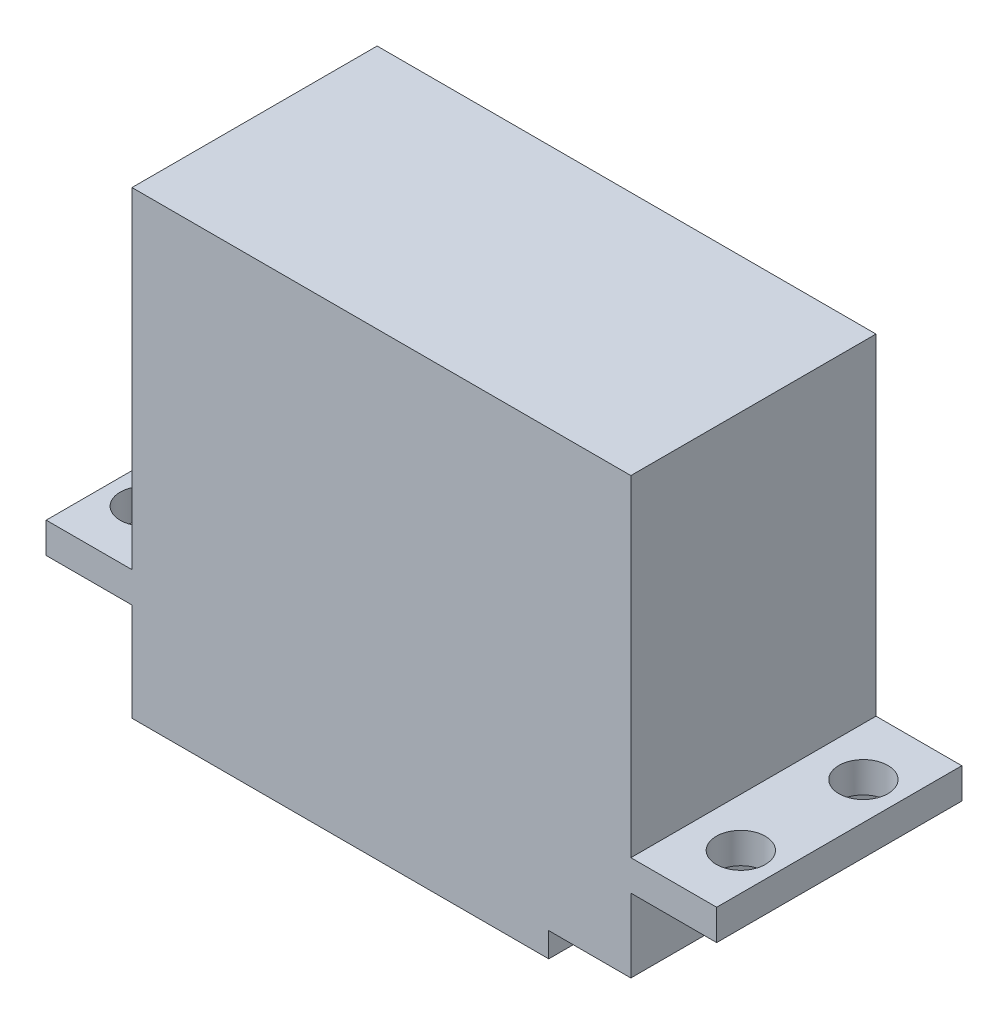
ISO-10303-21;
HEADER;
FILE_DESCRIPTION(('STEP AP214'),'2;1');
FILE_NAME('part.step','',(''),(''),'','','');
FILE_SCHEMA(('AUTOMOTIVE_DESIGN { 1 0 10303 214 1 1 1 1 }'));
ENDSEC;
DATA;
#1=APPLICATION_CONTEXT('core data for automotive mechanical design processes');
#2=APPLICATION_PROTOCOL_DEFINITION('international standard','automotive_design',2000,#1);
#3=PRODUCT_CONTEXT('',#1,'mechanical');
#4=PRODUCT('Part','Part','',(#3));
#5=PRODUCT_RELATED_PRODUCT_CATEGORY('part','',(#4));
#6=PRODUCT_DEFINITION_FORMATION('','',#4);
#7=PRODUCT_DEFINITION_CONTEXT('part definition',#1,'design');
#8=PRODUCT_DEFINITION('design','',#6,#7);
#9=PRODUCT_DEFINITION_SHAPE('','',#8);
#10=(LENGTH_UNIT() NAMED_UNIT(*) SI_UNIT(.MILLI.,.METRE.));
#11=(NAMED_UNIT(*) PLANE_ANGLE_UNIT() SI_UNIT($,.RADIAN.));
#12=(NAMED_UNIT(*) SI_UNIT($,.STERADIAN.) SOLID_ANGLE_UNIT());
#13=UNCERTAINTY_MEASURE_WITH_UNIT(LENGTH_MEASURE(1.E-05),#10,'distance_accuracy_value','');
#14=(GEOMETRIC_REPRESENTATION_CONTEXT(3) GLOBAL_UNCERTAINTY_ASSIGNED_CONTEXT((#13)) GLOBAL_UNIT_ASSIGNED_CONTEXT((#10,
#11,#12)) REPRESENTATION_CONTEXT('',''));
#15=CARTESIAN_POINT('',(0.,0.,0.));
#16=DIRECTION('',(0.,0.,1.));
#17=DIRECTION('',(1.,0.,0.));
#18=AXIS2_PLACEMENT_3D('',#15,#16,#17);
#19=CARTESIAN_POINT('',(20.35,-18.8445945945946,20.));
#20=DIRECTION('',(0.,1.,0.));
#21=DIRECTION('',(-1.,0.,0.));
#22=AXIS2_PLACEMENT_3D('',#19,#20,#21);
#23=PLANE('',#22);
#24=DIRECTION('',(0.,0.,1.));
#25=VECTOR('',#24,1.);
#26=CARTESIAN_POINT('',(13.65,-18.8445945945946,20.));
#27=LINE('',#26,#25);
#28=CARTESIAN_POINT('',(13.65,-18.8445945945946,0.));
#29=VERTEX_POINT('',#28);
#30=CARTESIAN_POINT('',(13.65,-18.8445945945946,20.));
#31=VERTEX_POINT('',#30);
#32=EDGE_CURVE('E52',#29,#31,#27,.T.);
#33=ORIENTED_EDGE('',*,*,#32,.F.);
#34=DIRECTION('',(1.,0.,0.));
#35=VECTOR('',#34,1.);
#36=CARTESIAN_POINT('',(20.35,-18.8445945945946,0.));
#37=LINE('',#36,#35);
#38=CARTESIAN_POINT('',(20.35,-18.8445945945946,0.));
#39=VERTEX_POINT('',#38);
#40=EDGE_CURVE('E180',#29,#39,#37,.T.);
#41=ORIENTED_EDGE('',*,*,#40,.T.);
#42=DIRECTION('',(0.,0.,-1.));
#43=VECTOR('',#42,1.);
#44=CARTESIAN_POINT('',(20.35,-18.8445945945946,20.));
#45=LINE('',#44,#43);
#46=CARTESIAN_POINT('',(20.35,-18.8445945945946,20.));
#47=VERTEX_POINT('',#46);
#48=EDGE_CURVE('E192',#47,#39,#45,.T.);
#49=ORIENTED_EDGE('',*,*,#48,.F.);
#50=DIRECTION('',(1.,0.,0.));
#51=VECTOR('',#50,1.);
#52=CARTESIAN_POINT('',(20.35,-18.8445945945946,20.));
#53=LINE('',#52,#51);
#54=EDGE_CURVE('E275',#31,#47,#53,.T.);
#55=ORIENTED_EDGE('',*,*,#54,.F.);
#56=EDGE_LOOP('',(#33,#41,#49,#55));
#57=FACE_BOUND('',#56,.T.);
#58=ADVANCED_FACE('F35',(#57),#23,.F.);
#59=CARTESIAN_POINT('',(20.35,16.6554054054054,20.));
#60=DIRECTION('',(-1.,0.,0.));
#61=DIRECTION('',(0.,-1.,0.));
#62=AXIS2_PLACEMENT_3D('',#59,#60,#61);
#63=PLANE('',#62);
#64=DIRECTION('',(0.,1.,0.));
#65=VECTOR('',#64,1.);
#66=CARTESIAN_POINT('',(20.35,16.6554054054054,0.));
#67=LINE('',#66,#65);
#68=CARTESIAN_POINT('',(20.35,-10.3445945945946,0.));
#69=VERTEX_POINT('',#68);
#70=CARTESIAN_POINT('',(20.35,16.6554054054054,0.));
#71=VERTEX_POINT('',#70);
#72=EDGE_CURVE('E163',#69,#71,#67,.T.);
#73=ORIENTED_EDGE('',*,*,#72,.T.);
#74=DIRECTION('',(0.,0.,-1.));
#75=VECTOR('',#74,1.);
#76=CARTESIAN_POINT('',(20.35,16.6554054054054,20.));
#77=LINE('',#76,#75);
#78=CARTESIAN_POINT('',(20.35,16.6554054054054,20.));
#79=VERTEX_POINT('',#78);
#80=EDGE_CURVE('E11',#79,#71,#77,.T.);
#81=ORIENTED_EDGE('',*,*,#80,.F.);
#82=DIRECTION('',(0.,1.,0.));
#83=VECTOR('',#82,1.);
#84=CARTESIAN_POINT('',(20.35,16.6554054054054,20.));
#85=LINE('',#84,#83);
#86=CARTESIAN_POINT('',(20.35,-10.3445945945946,20.));
#87=VERTEX_POINT('',#86);
#88=EDGE_CURVE('E188',#87,#79,#85,.T.);
#89=ORIENTED_EDGE('',*,*,#88,.F.);
#90=DIRECTION('',(0.,0.,-1.));
#91=VECTOR('',#90,1.);
#92=CARTESIAN_POINT('',(20.35,-10.3445945945946,20.));
#93=LINE('',#92,#91);
#94=EDGE_CURVE('E159',#87,#69,#93,.T.);
#95=ORIENTED_EDGE('',*,*,#94,.T.);
#96=EDGE_LOOP('',(#73,#81,#89,#95));
#97=FACE_BOUND('',#96,.T.);
#98=ADVANCED_FACE('F37',(#97),#63,.F.);
#99=CARTESIAN_POINT('',(-20.35,16.6554054054054,20.));
#100=DIRECTION('',(0.,-1.,0.));
#101=DIRECTION('',(1.,0.,0.));
#102=AXIS2_PLACEMENT_3D('',#99,#100,#101);
#103=PLANE('',#102);
#104=DIRECTION('',(-1.,0.,0.));
#105=VECTOR('',#104,1.);
#106=CARTESIAN_POINT('',(-20.35,16.6554054054054,0.));
#107=LINE('',#106,#105);
#108=CARTESIAN_POINT('',(-20.35,16.6554054054054,0.));
#109=VERTEX_POINT('',#108);
#110=EDGE_CURVE('E166',#71,#109,#107,.T.);
#111=ORIENTED_EDGE('',*,*,#110,.T.);
#112=DIRECTION('',(0.,0.,-1.));
#113=VECTOR('',#112,1.);
#114=CARTESIAN_POINT('',(-20.35,16.6554054054054,20.));
#115=LINE('',#114,#113);
#116=CARTESIAN_POINT('',(-20.35,16.6554054054054,20.));
#117=VERTEX_POINT('',#116);
#118=EDGE_CURVE('E44',#117,#109,#115,.T.);
#119=ORIENTED_EDGE('',*,*,#118,.F.);
#120=DIRECTION('',(-1.,0.,0.));
#121=VECTOR('',#120,1.);
#122=CARTESIAN_POINT('',(-20.35,16.6554054054054,20.));
#123=LINE('',#122,#121);
#124=EDGE_CURVE('E110',#79,#117,#123,.T.);
#125=ORIENTED_EDGE('',*,*,#124,.F.);
#126=ORIENTED_EDGE('',*,*,#80,.T.);
#127=EDGE_LOOP('',(#111,#119,#125,#126));
#128=FACE_BOUND('',#127,.T.);
#129=ADVANCED_FACE('F291',(#128),#103,.F.);
#130=CARTESIAN_POINT('',(-20.35,16.6554054054054,20.));
#131=DIRECTION('',(1.,0.,0.));
#132=DIRECTION('',(0.,1.,0.));
#133=AXIS2_PLACEMENT_3D('',#130,#131,#132);
#134=PLANE('',#133);
#135=DIRECTION('',(0.,-1.,0.));
#136=VECTOR('',#135,1.);
#137=CARTESIAN_POINT('',(-20.35,16.6554054054054,0.));
#138=LINE('',#137,#136);
#139=CARTESIAN_POINT('',(-20.35,-10.3445945945946,0.));
#140=VERTEX_POINT('',#139);
#141=EDGE_CURVE('E169',#109,#140,#138,.T.);
#142=ORIENTED_EDGE('',*,*,#141,.T.);
#143=DIRECTION('',(0.,0.,-1.));
#144=VECTOR('',#143,1.);
#145=CARTESIAN_POINT('',(-20.35,-10.3445945945946,20.));
#146=LINE('',#145,#144);
#147=CARTESIAN_POINT('',(-20.35,-10.3445945945946,20.));
#148=VERTEX_POINT('',#147);
#149=EDGE_CURVE('E204',#148,#140,#146,.T.);
#150=ORIENTED_EDGE('',*,*,#149,.F.);
#151=DIRECTION('',(0.,-1.,0.));
#152=VECTOR('',#151,1.);
#153=CARTESIAN_POINT('',(-20.35,16.6554054054054,20.));
#154=LINE('',#153,#152);
#155=EDGE_CURVE('E264',#117,#148,#154,.T.);
#156=ORIENTED_EDGE('',*,*,#155,.F.);
#157=ORIENTED_EDGE('',*,*,#118,.T.);
#158=EDGE_LOOP('',(#142,#150,#156,#157));
#159=FACE_BOUND('',#158,.T.);
#160=ADVANCED_FACE('F294',(#159),#134,.F.);
#161=CARTESIAN_POINT('',(-20.35,-10.3445945945946,20.));
#162=DIRECTION('',(0.,-1.,0.));
#163=DIRECTION('',(0.,0.,-1.));
#164=AXIS2_PLACEMENT_3D('',#161,#162,#163);
#165=PLANE('',#164);
#166=CARTESIAN_POINT('',(-24.315,-10.3445945945946,4.99354097072405));
#167=DIRECTION('',(0.,1.,0.));
#168=DIRECTION('',(0.,0.,1.));
#169=AXIS2_PLACEMENT_3D('',#166,#167,#168);
#170=CIRCLE('',#169,2.);
#171=CARTESIAN_POINT('',(-24.315,-10.3445945945946,6.99354097072405));
#172=VERTEX_POINT('',#171);
#173=EDGE_CURVE('E216',#172,#172,#170,.T.);
#174=ORIENTED_EDGE('',*,*,#173,.F.);
#175=EDGE_LOOP('',(#174));
#176=FACE_BOUND('',#175,.T.);
#177=CARTESIAN_POINT('',(-24.315,-10.3445945945946,14.993540970724));
#178=DIRECTION('',(0.,1.,0.));
#179=DIRECTION('',(0.,0.,-1.));
#180=AXIS2_PLACEMENT_3D('',#177,#178,#179);
#181=CIRCLE('',#180,2.);
#182=CARTESIAN_POINT('',(-24.315,-10.3445945945946,12.993540970724));
#183=VERTEX_POINT('',#182);
#184=EDGE_CURVE('E225',#183,#183,#181,.T.);
#185=ORIENTED_EDGE('',*,*,#184,.F.);
#186=EDGE_LOOP('',(#185));
#187=FACE_BOUND('',#186,.T.);
#188=DIRECTION('',(-1.,0.,0.));
#189=VECTOR('',#188,1.);
#190=CARTESIAN_POINT('',(-20.35,-10.3445945945946,0.));
#191=LINE('',#190,#189);
#192=CARTESIAN_POINT('',(-27.35,-10.3445945945946,0.));
#193=VERTEX_POINT('',#192);
#194=EDGE_CURVE('E171',#140,#193,#191,.T.);
#195=ORIENTED_EDGE('',*,*,#194,.T.);
#196=DIRECTION('',(0.,0.,-1.));
#197=VECTOR('',#196,1.);
#198=CARTESIAN_POINT('',(-27.35,-10.3445945945946,20.));
#199=LINE('',#198,#197);
#200=CARTESIAN_POINT('',(-27.35,-10.3445945945946,20.));
#201=VERTEX_POINT('',#200);
#202=EDGE_CURVE('E201',#201,#193,#199,.T.);
#203=ORIENTED_EDGE('',*,*,#202,.F.);
#204=DIRECTION('',(-1.,0.,0.));
#205=VECTOR('',#204,1.);
#206=CARTESIAN_POINT('',(-20.35,-10.3445945945946,20.));
#207=LINE('',#206,#205);
#208=EDGE_CURVE('E266',#148,#201,#207,.T.);
#209=ORIENTED_EDGE('',*,*,#208,.F.);
#210=ORIENTED_EDGE('',*,*,#149,.T.);
#211=EDGE_LOOP('',(#195,#203,#209,#210));
#212=FACE_BOUND('',#211,.T.);
#213=ADVANCED_FACE('F299',(#176,#187,#212),#165,.F.);
#214=CARTESIAN_POINT('',(-27.35,-10.3445945945946,20.));
#215=DIRECTION('',(1.,0.,0.));
#216=DIRECTION('',(0.,1.,0.));
#217=AXIS2_PLACEMENT_3D('',#214,#215,#216);
#218=PLANE('',#217);
#219=DIRECTION('',(0.,-1.,0.));
#220=VECTOR('',#219,1.);
#221=CARTESIAN_POINT('',(-27.35,-10.3445945945946,0.));
#222=LINE('',#221,#220);
#223=CARTESIAN_POINT('',(-27.35,-12.8445945945946,0.));
#224=VERTEX_POINT('',#223);
#225=EDGE_CURVE('E173',#193,#224,#222,.T.);
#226=ORIENTED_EDGE('',*,*,#225,.T.);
#227=DIRECTION('',(0.,0.,-1.));
#228=VECTOR('',#227,1.);
#229=CARTESIAN_POINT('',(-27.35,-12.8445945945946,20.));
#230=LINE('',#229,#228);
#231=CARTESIAN_POINT('',(-27.35,-12.8445945945946,20.));
#232=VERTEX_POINT('',#231);
#233=EDGE_CURVE('E198',#232,#224,#230,.T.);
#234=ORIENTED_EDGE('',*,*,#233,.F.);
#235=DIRECTION('',(0.,-1.,0.));
#236=VECTOR('',#235,1.);
#237=CARTESIAN_POINT('',(-27.35,-10.3445945945946,20.));
#238=LINE('',#237,#236);
#239=EDGE_CURVE('E268',#201,#232,#238,.T.);
#240=ORIENTED_EDGE('',*,*,#239,.F.);
#241=ORIENTED_EDGE('',*,*,#202,.T.);
#242=EDGE_LOOP('',(#226,#234,#240,#241));
#243=FACE_BOUND('',#242,.T.);
#244=ADVANCED_FACE('F305',(#243),#218,.F.);
#245=CARTESIAN_POINT('',(-27.35,-12.8445945945946,20.));
#246=DIRECTION('',(0.,1.,0.));
#247=DIRECTION('',(-1.,0.,0.));
#248=AXIS2_PLACEMENT_3D('',#245,#246,#247);
#249=PLANE('',#248);
#250=CARTESIAN_POINT('',(-24.315,-12.8445945945946,4.99354097072405));
#251=DIRECTION('',(0.,1.,0.));
#252=DIRECTION('',(-1.,0.,0.));
#253=AXIS2_PLACEMENT_3D('',#250,#251,#252);
#254=CIRCLE('',#253,2.);
#255=CARTESIAN_POINT('',(-26.315,-12.8445945945946,4.99354097072405));
#256=VERTEX_POINT('',#255);
#257=EDGE_CURVE('E39',#256,#256,#254,.T.);
#258=ORIENTED_EDGE('',*,*,#257,.T.);
#259=EDGE_LOOP('',(#258));
#260=FACE_BOUND('',#259,.T.);
#261=CARTESIAN_POINT('',(-24.315,-12.8445945945946,14.993540970724));
#262=DIRECTION('',(0.,1.,0.));
#263=DIRECTION('',(-1.,0.,0.));
#264=AXIS2_PLACEMENT_3D('',#261,#262,#263);
#265=CIRCLE('',#264,2.);
#266=CARTESIAN_POINT('',(-26.315,-12.8445945945946,14.993540970724));
#267=VERTEX_POINT('',#266);
#268=EDGE_CURVE('E208',#267,#267,#265,.T.);
#269=ORIENTED_EDGE('',*,*,#268,.T.);
#270=EDGE_LOOP('',(#269));
#271=FACE_BOUND('',#270,.T.);
#272=DIRECTION('',(1.,0.,0.));
#273=VECTOR('',#272,1.);
#274=CARTESIAN_POINT('',(-27.35,-12.8445945945946,0.));
#275=LINE('',#274,#273);
#276=CARTESIAN_POINT('',(-20.35,-12.8445945945946,0.));
#277=VERTEX_POINT('',#276);
#278=EDGE_CURVE('E175',#224,#277,#275,.T.);
#279=ORIENTED_EDGE('',*,*,#278,.T.);
#280=DIRECTION('',(0.,0.,-1.));
#281=VECTOR('',#280,1.);
#282=CARTESIAN_POINT('',(-20.35,-12.8445945945946,20.));
#283=LINE('',#282,#281);
#284=CARTESIAN_POINT('',(-20.35,-12.8445945945946,20.));
#285=VERTEX_POINT('',#284);
#286=EDGE_CURVE('E195',#285,#277,#283,.T.);
#287=ORIENTED_EDGE('',*,*,#286,.F.);
#288=DIRECTION('',(1.,0.,0.));
#289=VECTOR('',#288,1.);
#290=CARTESIAN_POINT('',(-27.35,-12.8445945945946,20.));
#291=LINE('',#290,#289);
#292=EDGE_CURVE('E270',#232,#285,#291,.T.);
#293=ORIENTED_EDGE('',*,*,#292,.F.);
#294=ORIENTED_EDGE('',*,*,#233,.T.);
#295=EDGE_LOOP('',(#279,#287,#293,#294));
#296=FACE_BOUND('',#295,.T.);
#297=ADVANCED_FACE('F309',(#260,#271,#296),#249,.F.);
#298=CARTESIAN_POINT('',(-20.35,-12.8445945945946,20.));
#299=DIRECTION('',(1.,0.,0.));
#300=DIRECTION('',(0.,0.,-1.));
#301=AXIS2_PLACEMENT_3D('',#298,#299,#300);
#302=PLANE('',#301);
#303=DIRECTION('',(0.,-1.,0.));
#304=VECTOR('',#303,1.);
#305=CARTESIAN_POINT('',(-20.35,-12.8445945945946,0.));
#306=LINE('',#305,#304);
#307=CARTESIAN_POINT('',(-20.35,-20.8445945945946,0.));
#308=VERTEX_POINT('',#307);
#309=EDGE_CURVE('E177',#277,#308,#306,.T.);
#310=ORIENTED_EDGE('',*,*,#309,.T.);
#311=DIRECTION('',(0.,0.,-1.));
#312=VECTOR('',#311,1.);
#313=CARTESIAN_POINT('',(-20.35,-20.8445945945946,20.));
#314=LINE('',#313,#312);
#315=CARTESIAN_POINT('',(-20.35,-20.8445945945946,20.));
#316=VERTEX_POINT('',#315);
#317=EDGE_CURVE('E244',#316,#308,#314,.T.);
#318=ORIENTED_EDGE('',*,*,#317,.F.);
#319=DIRECTION('',(0.,-1.,0.));
#320=VECTOR('',#319,1.);
#321=CARTESIAN_POINT('',(-20.35,-12.8445945945946,20.));
#322=LINE('',#321,#320);
#323=EDGE_CURVE('E272',#285,#316,#322,.T.);
#324=ORIENTED_EDGE('',*,*,#323,.F.);
#325=ORIENTED_EDGE('',*,*,#286,.T.);
#326=EDGE_LOOP('',(#310,#318,#324,#325));
#327=FACE_BOUND('',#326,.T.);
#328=ADVANCED_FACE('F314',(#327),#302,.F.);
#329=CARTESIAN_POINT('',(20.35,-12.8445945945946,20.));
#330=DIRECTION('',(-1.,0.,0.));
#331=DIRECTION('',(0.,0.,1.));
#332=AXIS2_PLACEMENT_3D('',#329,#330,#331);
#333=PLANE('',#332);
#334=DIRECTION('',(0.,1.,0.));
#335=VECTOR('',#334,1.);
#336=CARTESIAN_POINT('',(20.35,-12.8445945945946,0.));
#337=LINE('',#336,#335);
#338=CARTESIAN_POINT('',(20.35,-12.8445945945946,0.));
#339=VERTEX_POINT('',#338);
#340=EDGE_CURVE('E182',#39,#339,#337,.T.);
#341=ORIENTED_EDGE('',*,*,#340,.T.);
#342=DIRECTION('',(0.,0.,-1.));
#343=VECTOR('',#342,1.);
#344=CARTESIAN_POINT('',(20.35,-12.8445945945946,20.));
#345=LINE('',#344,#343);
#346=CARTESIAN_POINT('',(20.35,-12.8445945945946,20.));
#347=VERTEX_POINT('',#346);
#348=EDGE_CURVE('E154',#347,#339,#345,.T.);
#349=ORIENTED_EDGE('',*,*,#348,.F.);
#350=DIRECTION('',(0.,1.,0.));
#351=VECTOR('',#350,1.);
#352=CARTESIAN_POINT('',(20.35,-12.8445945945946,20.));
#353=LINE('',#352,#351);
#354=EDGE_CURVE('E142',#47,#347,#353,.T.);
#355=ORIENTED_EDGE('',*,*,#354,.F.);
#356=ORIENTED_EDGE('',*,*,#48,.T.);
#357=EDGE_LOOP('',(#341,#349,#355,#356));
#358=FACE_BOUND('',#357,.T.);
#359=ADVANCED_FACE('F281',(#358),#333,.F.);
#360=CARTESIAN_POINT('',(27.35,-12.8445945945946,20.));
#361=DIRECTION('',(0.,1.,0.));
#362=DIRECTION('',(0.,0.,1.));
#363=AXIS2_PLACEMENT_3D('',#360,#361,#362);
#364=PLANE('',#363);
#365=CARTESIAN_POINT('',(24.315,-12.8445945945946,14.993540970724));
#366=DIRECTION('',(0.,1.,0.));
#367=DIRECTION('',(0.,0.,1.));
#368=AXIS2_PLACEMENT_3D('',#365,#366,#367);
#369=CIRCLE('',#368,2.);
#370=CARTESIAN_POINT('',(24.315,-12.8445945945946,16.9935409707241));
#371=VERTEX_POINT('',#370);
#372=EDGE_CURVE('E210',#371,#371,#369,.T.);
#373=ORIENTED_EDGE('',*,*,#372,.T.);
#374=EDGE_LOOP('',(#373));
#375=FACE_BOUND('',#374,.T.);
#376=CARTESIAN_POINT('',(24.315,-12.8445945945946,4.99354097072405));
#377=DIRECTION('',(0.,1.,0.));
#378=DIRECTION('',(0.,0.,1.));
#379=AXIS2_PLACEMENT_3D('',#376,#377,#378);
#380=CIRCLE('',#379,2.);
#381=CARTESIAN_POINT('',(24.315,-12.8445945945946,6.99354097072405));
#382=VERTEX_POINT('',#381);
#383=EDGE_CURVE('E229',#382,#382,#380,.T.);
#384=ORIENTED_EDGE('',*,*,#383,.T.);
#385=EDGE_LOOP('',(#384));
#386=FACE_BOUND('',#385,.T.);
#387=DIRECTION('',(1.,0.,0.));
#388=VECTOR('',#387,1.);
#389=CARTESIAN_POINT('',(27.35,-12.8445945945946,0.));
#390=LINE('',#389,#388);
#391=CARTESIAN_POINT('',(27.35,-12.8445945945946,0.));
#392=VERTEX_POINT('',#391);
#393=EDGE_CURVE('E151',#339,#392,#390,.T.);
#394=ORIENTED_EDGE('',*,*,#393,.T.);
#395=DIRECTION('',(0.,0.,-1.));
#396=VECTOR('',#395,1.);
#397=CARTESIAN_POINT('',(27.35,-12.8445945945946,20.));
#398=LINE('',#397,#396);
#399=CARTESIAN_POINT('',(27.35,-12.8445945945946,20.));
#400=VERTEX_POINT('',#399);
#401=EDGE_CURVE('E148',#400,#392,#398,.T.);
#402=ORIENTED_EDGE('',*,*,#401,.F.);
#403=DIRECTION('',(1.,0.,0.));
#404=VECTOR('',#403,1.);
#405=CARTESIAN_POINT('',(27.35,-12.8445945945946,20.));
#406=LINE('',#405,#404);
#407=EDGE_CURVE('E135',#347,#400,#406,.T.);
#408=ORIENTED_EDGE('',*,*,#407,.F.);
#409=ORIENTED_EDGE('',*,*,#348,.T.);
#410=EDGE_LOOP('',(#394,#402,#408,#409));
#411=FACE_BOUND('',#410,.T.);
#412=ADVANCED_FACE('F149',(#375,#386,#411),#364,.F.);
#413=CARTESIAN_POINT('',(27.35,-10.3445945945946,20.));
#414=DIRECTION('',(-1.,0.,0.));
#415=DIRECTION('',(0.,-1.,0.));
#416=AXIS2_PLACEMENT_3D('',#413,#414,#415);
#417=PLANE('',#416);
#418=DIRECTION('',(0.,1.,0.));
#419=VECTOR('',#418,1.);
#420=CARTESIAN_POINT('',(27.35,-10.3445945945946,0.));
#421=LINE('',#420,#419);
#422=CARTESIAN_POINT('',(27.35,-10.3445945945946,0.));
#423=VERTEX_POINT('',#422);
#424=EDGE_CURVE('E185',#392,#423,#421,.T.);
#425=ORIENTED_EDGE('',*,*,#424,.T.);
#426=DIRECTION('',(0.,0.,-1.));
#427=VECTOR('',#426,1.);
#428=CARTESIAN_POINT('',(27.35,-10.3445945945946,20.));
#429=LINE('',#428,#427);
#430=CARTESIAN_POINT('',(27.35,-10.3445945945946,20.));
#431=VERTEX_POINT('',#430);
#432=EDGE_CURVE('E155',#431,#423,#429,.T.);
#433=ORIENTED_EDGE('',*,*,#432,.F.);
#434=DIRECTION('',(0.,1.,0.));
#435=VECTOR('',#434,1.);
#436=CARTESIAN_POINT('',(27.35,-10.3445945945946,20.));
#437=LINE('',#436,#435);
#438=EDGE_CURVE('E139',#400,#431,#437,.T.);
#439=ORIENTED_EDGE('',*,*,#438,.F.);
#440=ORIENTED_EDGE('',*,*,#401,.T.);
#441=EDGE_LOOP('',(#425,#433,#439,#440));
#442=FACE_BOUND('',#441,.T.);
#443=ADVANCED_FACE('F157',(#442),#417,.F.);
#444=CARTESIAN_POINT('',(20.35,-10.3445945945946,20.));
#445=DIRECTION('',(0.,-1.,0.));
#446=DIRECTION('',(1.,0.,0.));
#447=AXIS2_PLACEMENT_3D('',#444,#445,#446);
#448=PLANE('',#447);
#449=CARTESIAN_POINT('',(24.315,-10.3445945945946,14.993540970724));
#450=DIRECTION('',(0.,1.,0.));
#451=DIRECTION('',(0.,0.,1.));
#452=AXIS2_PLACEMENT_3D('',#449,#450,#451);
#453=CIRCLE('',#452,2.);
#454=CARTESIAN_POINT('',(24.315,-10.3445945945946,16.9935409707241));
#455=VERTEX_POINT('',#454);
#456=EDGE_CURVE('E221',#455,#455,#453,.T.);
#457=ORIENTED_EDGE('',*,*,#456,.F.);
#458=EDGE_LOOP('',(#457));
#459=FACE_BOUND('',#458,.T.);
#460=CARTESIAN_POINT('',(24.315,-10.3445945945946,4.99354097072405));
#461=DIRECTION('',(0.,1.,0.));
#462=DIRECTION('',(0.,0.,-1.));
#463=AXIS2_PLACEMENT_3D('',#460,#461,#462);
#464=CIRCLE('',#463,2.);
#465=CARTESIAN_POINT('',(24.315,-10.3445945945946,2.99354097072404));
#466=VERTEX_POINT('',#465);
#467=EDGE_CURVE('E214',#466,#466,#464,.T.);
#468=ORIENTED_EDGE('',*,*,#467,.F.);
#469=EDGE_LOOP('',(#468));
#470=FACE_BOUND('',#469,.T.);
#471=DIRECTION('',(-1.,0.,0.));
#472=VECTOR('',#471,1.);
#473=CARTESIAN_POINT('',(20.35,-10.3445945945946,0.));
#474=LINE('',#473,#472);
#475=EDGE_CURVE('E102',#423,#69,#474,.T.);
#476=ORIENTED_EDGE('',*,*,#475,.T.);
#477=ORIENTED_EDGE('',*,*,#94,.F.);
#478=DIRECTION('',(-1.,0.,0.));
#479=VECTOR('',#478,1.);
#480=CARTESIAN_POINT('',(20.35,-10.3445945945946,20.));
#481=LINE('',#480,#479);
#482=EDGE_CURVE('E61',#431,#87,#481,.T.);
#483=ORIENTED_EDGE('',*,*,#482,.F.);
#484=ORIENTED_EDGE('',*,*,#432,.T.);
#485=EDGE_LOOP('',(#476,#477,#483,#484));
#486=FACE_BOUND('',#485,.T.);
#487=ADVANCED_FACE('F285',(#459,#470,#486),#448,.F.);
#488=CARTESIAN_POINT('',(0.,0.,20.));
#489=DIRECTION('',(0.,0.,1.));
#490=DIRECTION('',(1.,0.,0.));
#491=AXIS2_PLACEMENT_3D('',#488,#489,#490);
#492=PLANE('',#491);
#493=ORIENTED_EDGE('',*,*,#88,.T.);
#494=ORIENTED_EDGE('',*,*,#124,.T.);
#495=ORIENTED_EDGE('',*,*,#155,.T.);
#496=ORIENTED_EDGE('',*,*,#208,.T.);
#497=ORIENTED_EDGE('',*,*,#239,.T.);
#498=ORIENTED_EDGE('',*,*,#292,.T.);
#499=ORIENTED_EDGE('',*,*,#323,.T.);
#500=DIRECTION('',(-1.,0.,0.));
#501=VECTOR('',#500,1.);
#502=CARTESIAN_POINT('',(-20.35,-20.8445945945946,20.));
#503=LINE('',#502,#501);
#504=CARTESIAN_POINT('',(13.65,-20.8445945945946,20.));
#505=VERTEX_POINT('',#504);
#506=EDGE_CURVE('E253',#505,#316,#503,.T.);
#507=ORIENTED_EDGE('',*,*,#506,.F.);
#508=DIRECTION('',(0.,1.,0.));
#509=VECTOR('',#508,1.);
#510=CARTESIAN_POINT('',(13.65,-20.8445945945946,20.));
#511=LINE('',#510,#509);
#512=EDGE_CURVE('E256',#505,#31,#511,.T.);
#513=ORIENTED_EDGE('',*,*,#512,.T.);
#514=ORIENTED_EDGE('',*,*,#54,.T.);
#515=ORIENTED_EDGE('',*,*,#354,.T.);
#516=ORIENTED_EDGE('',*,*,#407,.T.);
#517=ORIENTED_EDGE('',*,*,#438,.T.);
#518=ORIENTED_EDGE('',*,*,#482,.T.);
#519=EDGE_LOOP('',(#493,#494,#495,#496,#497,#498,#499,#507,#513,#514,#515,#516,#517,#518));
#520=FACE_BOUND('',#519,.T.);
#521=ADVANCED_FACE('F137',(#520),#492,.T.);
#522=CARTESIAN_POINT('',(0.,0.,0.));
#523=DIRECTION('',(0.,0.,1.));
#524=DIRECTION('',(1.,0.,0.));
#525=AXIS2_PLACEMENT_3D('',#522,#523,#524);
#526=PLANE('',#525);
#527=ORIENTED_EDGE('',*,*,#72,.F.);
#528=ORIENTED_EDGE('',*,*,#475,.F.);
#529=ORIENTED_EDGE('',*,*,#424,.F.);
#530=ORIENTED_EDGE('',*,*,#393,.F.);
#531=ORIENTED_EDGE('',*,*,#340,.F.);
#532=ORIENTED_EDGE('',*,*,#40,.F.);
#533=DIRECTION('',(0.,1.,0.));
#534=VECTOR('',#533,1.);
#535=CARTESIAN_POINT('',(13.65,-20.8445945945946,0.));
#536=LINE('',#535,#534);
#537=CARTESIAN_POINT('',(13.65,-20.8445945945946,0.));
#538=VERTEX_POINT('',#537);
#539=EDGE_CURVE('E167',#538,#29,#536,.T.);
#540=ORIENTED_EDGE('',*,*,#539,.F.);
#541=DIRECTION('',(1.,0.,0.));
#542=VECTOR('',#541,1.);
#543=CARTESIAN_POINT('',(-20.35,-20.8445945945946,0.));
#544=LINE('',#543,#542);
#545=EDGE_CURVE('E247',#308,#538,#544,.T.);
#546=ORIENTED_EDGE('',*,*,#545,.F.);
#547=ORIENTED_EDGE('',*,*,#309,.F.);
#548=ORIENTED_EDGE('',*,*,#278,.F.);
#549=ORIENTED_EDGE('',*,*,#225,.F.);
#550=ORIENTED_EDGE('',*,*,#194,.F.);
#551=ORIENTED_EDGE('',*,*,#141,.F.);
#552=ORIENTED_EDGE('',*,*,#110,.F.);
#553=EDGE_LOOP('',(#527,#528,#529,#530,#531,#532,#540,#546,#547,#548,#549,#550,#551,#552));
#554=FACE_BOUND('',#553,.T.);
#555=ADVANCED_FACE('F284',(#554),#526,.F.);
#556=CARTESIAN_POINT('',(13.65,-20.8445945945946,20.));
#557=DIRECTION('',(-1.,0.,0.));
#558=DIRECTION('',(0.,-1.,0.));
#559=AXIS2_PLACEMENT_3D('',#556,#557,#558);
#560=PLANE('',#559);
#561=ORIENTED_EDGE('',*,*,#32,.T.);
#562=ORIENTED_EDGE('',*,*,#512,.F.);
#563=DIRECTION('',(0.,0.,1.));
#564=VECTOR('',#563,1.);
#565=CARTESIAN_POINT('',(13.65,-20.8445945945946,20.));
#566=LINE('',#565,#564);
#567=EDGE_CURVE('E250',#538,#505,#566,.T.);
#568=ORIENTED_EDGE('',*,*,#567,.F.);
#569=ORIENTED_EDGE('',*,*,#539,.T.);
#570=EDGE_LOOP('',(#561,#562,#568,#569));
#571=FACE_BOUND('',#570,.T.);
#572=ADVANCED_FACE('F325',(#571),#560,.F.);
#573=CARTESIAN_POINT('',(0.,-20.8445945945946,0.));
#574=DIRECTION('',(0.,-1.,0.));
#575=DIRECTION('',(0.,0.,-1.));
#576=AXIS2_PLACEMENT_3D('',#573,#574,#575);
#577=PLANE('',#576);
#578=CARTESIAN_POINT('',(-10.3649715284219,-20.8445945945946,10.));
#579=DIRECTION('',(0.,-1.,0.));
#580=DIRECTION('',(0.,0.,-1.));
#581=AXIS2_PLACEMENT_3D('',#578,#579,#580);
#582=CIRCLE('',#581,6.5);
#583=CARTESIAN_POINT('',(-10.3649715284219,-20.8445945945946,3.5));
#584=VERTEX_POINT('',#583);
#585=EDGE_CURVE('E236',#584,#584,#582,.T.);
#586=ORIENTED_EDGE('',*,*,#585,.F.);
#587=EDGE_LOOP('',(#586));
#588=FACE_BOUND('',#587,.T.);
#589=ORIENTED_EDGE('',*,*,#317,.T.);
#590=ORIENTED_EDGE('',*,*,#545,.T.);
#591=ORIENTED_EDGE('',*,*,#567,.T.);
#592=ORIENTED_EDGE('',*,*,#506,.T.);
#593=EDGE_LOOP('',(#589,#590,#591,#592));
#594=FACE_BOUND('',#593,.T.);
#595=ADVANCED_FACE('F317',(#588,#594),#577,.T.);
#596=CARTESIAN_POINT('',(-10.3649715284219,-22.3445945945946,10.));
#597=DIRECTION('',(0.,1.,0.));
#598=DIRECTION('',(0.,0.,1.));
#599=AXIS2_PLACEMENT_3D('',#596,#597,#598);
#600=CYLINDRICAL_SURFACE('',#599,6.5);
#601=CARTESIAN_POINT('',(-10.3649715284219,-22.3445945945946,10.));
#602=DIRECTION('',(0.,-1.,0.));
#603=DIRECTION('',(0.,0.,-1.));
#604=AXIS2_PLACEMENT_3D('',#601,#602,#603);
#605=CIRCLE('',#604,6.5);
#606=CARTESIAN_POINT('',(-10.3649715284219,-22.3445945945946,3.5));
#607=VERTEX_POINT('',#606);
#608=EDGE_CURVE('E239',#607,#607,#605,.T.);
#609=ORIENTED_EDGE('',*,*,#608,.F.);
#610=EDGE_LOOP('',(#609));
#611=FACE_BOUND('',#610,.T.);
#612=ORIENTED_EDGE('',*,*,#585,.T.);
#613=EDGE_LOOP('',(#612));
#614=FACE_BOUND('',#613,.T.);
#615=ADVANCED_FACE('F334',(#611,#614),#600,.T.);
#616=CARTESIAN_POINT('',(-10.3649715284219,-22.3445945945946,10.));
#617=DIRECTION('',(0.,-1.,0.));
#618=DIRECTION('',(0.,0.,-1.));
#619=AXIS2_PLACEMENT_3D('',#616,#617,#618);
#620=PLANE('',#619);
#621=CARTESIAN_POINT('',(-10.3649715284219,-22.3445945945946,10.));
#622=DIRECTION('',(0.,-1.,0.));
#623=DIRECTION('',(0.,0.,-1.));
#624=AXIS2_PLACEMENT_3D('',#621,#622,#623);
#625=CIRCLE('',#624,2.75);
#626=CARTESIAN_POINT('',(-10.3649715284219,-22.3445945945946,7.25));
#627=VERTEX_POINT('',#626);
#628=EDGE_CURVE('E232',#627,#627,#625,.T.);
#629=ORIENTED_EDGE('',*,*,#628,.F.);
#630=EDGE_LOOP('',(#629));
#631=FACE_BOUND('',#630,.T.);
#632=ORIENTED_EDGE('',*,*,#608,.T.);
#633=EDGE_LOOP('',(#632));
#634=FACE_BOUND('',#633,.T.);
#635=ADVANCED_FACE('F451',(#631,#634),#620,.T.);
#636=CARTESIAN_POINT('',(-10.3649715284219,-26.3445945945946,10.));
#637=DIRECTION('',(0.,1.,0.));
#638=DIRECTION('',(0.,0.,1.));
#639=AXIS2_PLACEMENT_3D('',#636,#637,#638);
#640=CYLINDRICAL_SURFACE('',#639,2.75);
#641=CARTESIAN_POINT('',(-10.3649715284219,-26.3445945945946,10.));
#642=DIRECTION('',(0.,-1.,0.));
#643=DIRECTION('',(0.,0.,-1.));
#644=AXIS2_PLACEMENT_3D('',#641,#642,#643);
#645=CIRCLE('',#644,2.75);
#646=CARTESIAN_POINT('',(-10.3649715284219,-26.3445945945946,7.25));
#647=VERTEX_POINT('',#646);
#648=EDGE_CURVE('E233',#647,#647,#645,.T.);
#649=ORIENTED_EDGE('',*,*,#648,.F.);
#650=EDGE_LOOP('',(#649));
#651=FACE_BOUND('',#650,.T.);
#652=ORIENTED_EDGE('',*,*,#628,.T.);
#653=EDGE_LOOP('',(#652));
#654=FACE_BOUND('',#653,.T.);
#655=ADVANCED_FACE('F461',(#651,#654),#640,.T.);
#656=CARTESIAN_POINT('',(-10.3649715284219,-26.3445945945946,10.));
#657=DIRECTION('',(0.,-1.,0.));
#658=DIRECTION('',(0.,0.,-1.));
#659=AXIS2_PLACEMENT_3D('',#656,#657,#658);
#660=PLANE('',#659);
#661=ORIENTED_EDGE('',*,*,#648,.T.);
#662=EDGE_LOOP('',(#661));
#663=FACE_BOUND('',#662,.T.);
#664=ADVANCED_FACE('F470',(#663),#660,.T.);
#665=CARTESIAN_POINT('',(24.315,-26.3445945945946,4.99354097072405));
#666=DIRECTION('',(0.,1.,0.));
#667=DIRECTION('',(0.,0.,1.));
#668=AXIS2_PLACEMENT_3D('',#665,#666,#667);
#669=CYLINDRICAL_SURFACE('',#668,2.);
#670=ORIENTED_EDGE('',*,*,#467,.T.);
#671=EDGE_LOOP('',(#670));
#672=FACE_BOUND('',#671,.T.);
#673=ORIENTED_EDGE('',*,*,#383,.F.);
#674=EDGE_LOOP('',(#673));
#675=FACE_BOUND('',#674,.T.);
#676=ADVANCED_FACE('F479',(#672,#675),#669,.F.);
#677=CARTESIAN_POINT('',(24.315,-26.3445945945946,14.993540970724));
#678=DIRECTION('',(0.,1.,0.));
#679=DIRECTION('',(0.,0.,1.));
#680=AXIS2_PLACEMENT_3D('',#677,#678,#679);
#681=CYLINDRICAL_SURFACE('',#680,2.);
#682=ORIENTED_EDGE('',*,*,#456,.T.);
#683=EDGE_LOOP('',(#682));
#684=FACE_BOUND('',#683,.T.);
#685=ORIENTED_EDGE('',*,*,#372,.F.);
#686=EDGE_LOOP('',(#685));
#687=FACE_BOUND('',#686,.T.);
#688=ADVANCED_FACE('F489',(#684,#687),#681,.F.);
#689=CARTESIAN_POINT('',(-24.315,-26.3445945945946,14.993540970724));
#690=DIRECTION('',(0.,1.,0.));
#691=DIRECTION('',(0.,0.,1.));
#692=AXIS2_PLACEMENT_3D('',#689,#690,#691);
#693=CYLINDRICAL_SURFACE('',#692,2.);
#694=ORIENTED_EDGE('',*,*,#184,.T.);
#695=EDGE_LOOP('',(#694));
#696=FACE_BOUND('',#695,.T.);
#697=ORIENTED_EDGE('',*,*,#268,.F.);
#698=EDGE_LOOP('',(#697));
#699=FACE_BOUND('',#698,.T.);
#700=ADVANCED_FACE('F496',(#696,#699),#693,.F.);
#701=CARTESIAN_POINT('',(-24.315,-26.3445945945946,4.99354097072405));
#702=DIRECTION('',(0.,1.,0.));
#703=DIRECTION('',(0.,0.,1.));
#704=AXIS2_PLACEMENT_3D('',#701,#702,#703);
#705=CYLINDRICAL_SURFACE('',#704,2.);
#706=ORIENTED_EDGE('',*,*,#173,.T.);
#707=EDGE_LOOP('',(#706));
#708=FACE_BOUND('',#707,.T.);
#709=ORIENTED_EDGE('',*,*,#257,.F.);
#710=EDGE_LOOP('',(#709));
#711=FACE_BOUND('',#710,.T.);
#712=ADVANCED_FACE('F504',(#708,#711),#705,.F.);
#713=CLOSED_SHELL('',(#58,#98,#129,#160,#213,#244,#297,#328,#359,#412,#443,#487,#521,#555,#572,
#595,#615,#635,#655,#664,#676,#688,#700,#712));
#714=MANIFOLD_SOLID_BREP('B2',#713);
#715=ADVANCED_BREP_SHAPE_REPRESENTATION('',(#18,#714),#14);
#716=SHAPE_DEFINITION_REPRESENTATION(#9,#715);
ENDSEC;
END-ISO-10303-21;
